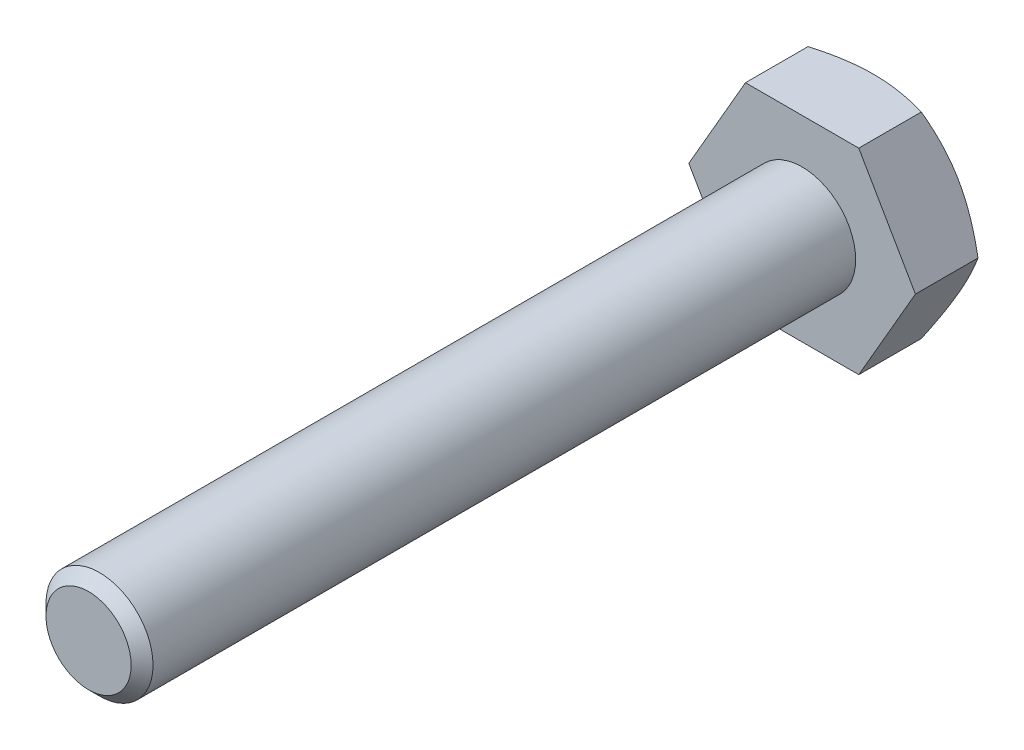
ISO-10303-21;
HEADER;
FILE_DESCRIPTION(('STEP AP214'),'2;1');
FILE_NAME('part.step','',(''),(''),'','','');
FILE_SCHEMA(('AUTOMOTIVE_DESIGN { 1 0 10303 214 1 1 1 1 }'));
ENDSEC;
DATA;
#1=APPLICATION_CONTEXT('core data for automotive mechanical design processes');
#2=APPLICATION_PROTOCOL_DEFINITION('international standard','automotive_design',2000,#1);
#3=PRODUCT_CONTEXT('',#1,'mechanical');
#4=PRODUCT('Part','Part','',(#3));
#5=PRODUCT_RELATED_PRODUCT_CATEGORY('part','',(#4));
#6=PRODUCT_DEFINITION_FORMATION('','',#4);
#7=PRODUCT_DEFINITION_CONTEXT('part definition',#1,'design');
#8=PRODUCT_DEFINITION('design','',#6,#7);
#9=PRODUCT_DEFINITION_SHAPE('','',#8);
#10=(LENGTH_UNIT() NAMED_UNIT(*) SI_UNIT(.MILLI.,.METRE.));
#11=(NAMED_UNIT(*) PLANE_ANGLE_UNIT() SI_UNIT($,.RADIAN.));
#12=(NAMED_UNIT(*) SI_UNIT($,.STERADIAN.) SOLID_ANGLE_UNIT());
#13=UNCERTAINTY_MEASURE_WITH_UNIT(LENGTH_MEASURE(1.E-05),#10,'distance_accuracy_value','');
#14=(GEOMETRIC_REPRESENTATION_CONTEXT(3) GLOBAL_UNCERTAINTY_ASSIGNED_CONTEXT((#13)) GLOBAL_UNIT_ASSIGNED_CONTEXT((#10,
#11,#12)) REPRESENTATION_CONTEXT('',''));
#15=CARTESIAN_POINT('',(0.,0.,0.));
#16=DIRECTION('',(0.,0.,1.));
#17=DIRECTION('',(1.,0.,0.));
#18=AXIS2_PLACEMENT_3D('',#15,#16,#17);
#19=CARTESIAN_POINT('',(1.58771324027147,-2.75,2.));
#20=DIRECTION('',(-0.866025403784439,0.5,0.));
#21=DIRECTION('',(-0.5,-0.866025403784439,0.));
#22=AXIS2_PLACEMENT_3D('',#19,#20,#21);
#23=PLANE('',#22);
#24=CARTESIAN_POINT('',(3.17554195059678,0.000200000000001707,0.245686763364756));
#25=CARTESIAN_POINT('',(3.10576962051743,-0.120649220659903,0.205387662249254));
#26=CARTESIAN_POINT('',(3.03539502097908,-0.24254160262263,0.168736902597655));
#27=CARTESIAN_POINT('',(2.89342717394439,-0.488437126727888,0.104762182969802));
#28=CARTESIAN_POINT('',(2.82183140359859,-0.612444638573851,0.0774608556745041));
#29=CARTESIAN_POINT('',(2.67952717191843,-0.858922797975938,0.0349617452941237));
#30=CARTESIAN_POINT('',(2.60884060771578,-0.981355518587411,0.0194811186224597));
#31=CARTESIAN_POINT('',(2.46713482015519,-1.22679714236891,0.000999397369939557));
#32=CARTESIAN_POINT('',(2.39611611197038,-1.3498051532329,-0.00201700053739912));
#33=CARTESIAN_POINT('',(2.26341005486545,-1.57965878661078,0.00425314542854933));
#34=CARTESIAN_POINT('',(2.20170285541369,-1.68653879125401,0.0120001542767048));
#35=CARTESIAN_POINT('',(2.07869048467395,-1.89960246733474,0.0365551810643593));
#36=CARTESIAN_POINT('',(2.01738573896434,-2.00578540164888,0.053371589650577));
#37=CARTESIAN_POINT('',(1.89411967378235,-2.21928848939318,0.0954119223459613));
#38=CARTESIAN_POINT('',(1.83217395817123,-2.32658161614285,0.120814080687232));
#39=CARTESIAN_POINT('',(1.70920651275308,-2.53956747928405,0.178467225839978));
#40=CARTESIAN_POINT('',(1.64818320715446,-2.64526294502665,0.210704663298978));
#41=CARTESIAN_POINT('',(1.58759777021763,-2.7502,0.245686763364763));
#42=B_SPLINE_CURVE_WITH_KNOTS('',3,(#24,#25,#26,#27,#28,#29,#30,#31,#32,#33,#34,#35,#36,#37,#38,
#39,#40,#41),.UNSPECIFIED.,.F.,.F.,(4,2,2,2,2,2,2,2,4),(0.,0.435912828725885,0.872873557116326,
1.29901931904671,1.72464171213572,2.09526089052937,2.46622354066374,2.84541551798557,
3.22386274754524),.UNSPECIFIED.);
#43=CARTESIAN_POINT('',(3.17542648054293,0.,0.245620093061856));
#44=VERTEX_POINT('',#43);
#45=CARTESIAN_POINT('',(2.38156986040721,-1.375,0.));
#46=VERTEX_POINT('',#45);
#47=EDGE_CURVE('E128',#44,#46,#42,.T.);
#48=ORIENTED_EDGE('',*,*,#47,.F.);
#49=DIRECTION('',(0.,0.,-1.));
#50=VECTOR('',#49,1.);
#51=CARTESIAN_POINT('',(3.17542648054294,0.,2.));
#52=LINE('',#51,#50);
#53=CARTESIAN_POINT('',(3.17542648054294,0.,2.));
#54=VERTEX_POINT('',#53);
#55=EDGE_CURVE('E132',#54,#44,#52,.T.);
#56=ORIENTED_EDGE('',*,*,#55,.F.);
#57=DIRECTION('',(0.5,0.866025403784438,0.));
#58=VECTOR('',#57,1.);
#59=CARTESIAN_POINT('',(1.58771324027147,-2.75,2.));
#60=LINE('',#59,#58);
#61=CARTESIAN_POINT('',(1.58771324027147,-2.75,2.));
#62=VERTEX_POINT('',#61);
#63=EDGE_CURVE('E246',#62,#54,#60,.T.);
#64=ORIENTED_EDGE('',*,*,#63,.F.);
#65=DIRECTION('',(0.,0.,-1.));
#66=VECTOR('',#65,1.);
#67=CARTESIAN_POINT('',(1.58771324027147,-2.75,2.));
#68=LINE('',#67,#66);
#69=CARTESIAN_POINT('',(1.58771324027145,-2.75,0.245620093061854));
#70=VERTEX_POINT('',#69);
#71=EDGE_CURVE('E222',#62,#70,#68,.T.);
#72=ORIENTED_EDGE('',*,*,#71,.T.);
#73=EDGE_CURVE('E185',#46,#70,#42,.T.);
#74=ORIENTED_EDGE('',*,*,#73,.F.);
#75=EDGE_LOOP('',(#48,#56,#64,#72,#74));
#76=FACE_BOUND('',#75,.T.);
#77=ADVANCED_FACE('F36',(#76),#23,.F.);
#78=CARTESIAN_POINT('',(3.17542648054294,0.,2.));
#79=DIRECTION('',(-0.866025403784438,-0.5,0.));
#80=DIRECTION('',(0.5,-0.866025403784438,0.));
#81=AXIS2_PLACEMENT_3D('',#78,#79,#80);
#82=PLANE('',#81);
#83=CARTESIAN_POINT('',(1.58759777021763,2.7502,0.245686763364752));
#84=CARTESIAN_POINT('',(1.65737010029698,2.6293507793401,0.205387662249252));
#85=CARTESIAN_POINT('',(1.72774469983533,2.50745839737737,0.168736902597655));
#86=CARTESIAN_POINT('',(1.86971254687002,2.26156287327211,0.104762182969804));
#87=CARTESIAN_POINT('',(1.94130831721583,2.13755536142615,0.0774608556745066));
#88=CARTESIAN_POINT('',(2.08361254889599,1.89107720202406,0.0349617452941277));
#89=CARTESIAN_POINT('',(2.15429911309864,1.76864448141259,0.0194811186224644));
#90=CARTESIAN_POINT('',(2.29600490065922,1.52320285763109,0.000999397369945049));
#91=CARTESIAN_POINT('',(2.36702360884403,1.40019484676709,-0.00201700053739336));
#92=CARTESIAN_POINT('',(2.49972966594897,1.17034121338921,0.00425314542855519));
#93=CARTESIAN_POINT('',(2.56143686540072,1.06346120874598,0.0120001542767105));
#94=CARTESIAN_POINT('',(2.68444923614046,0.850397532665255,0.0365551810643646));
#95=CARTESIAN_POINT('',(2.74575398185008,0.744214598351115,0.0533715896505821));
#96=CARTESIAN_POINT('',(2.86902004703206,0.530711510606819,0.0954119223459655));
#97=CARTESIAN_POINT('',(2.93096576264318,0.423418383857147,0.120814080687235));
#98=CARTESIAN_POINT('',(3.05393320806134,0.210432520715949,0.17846722583998));
#99=CARTESIAN_POINT('',(3.11495651365995,0.104737054973347,0.210704663298979));
#100=CARTESIAN_POINT('',(3.17554195059678,-0.000199999999999859,0.245686763364762));
#101=B_SPLINE_CURVE_WITH_KNOTS('',3,(#83,#84,#85,#86,#87,#88,#89,#90,#91,#92,#93,#94,#95,#96,
#97,#98,#99,#100),.UNSPECIFIED.,.F.,.F.,(4,2,2,2,2,2,2,2,4),(0.,0.435912828725885,
0.872873557116326,1.29901931904671,1.72464171213573,2.09526089052937,2.46622354066374,
2.84541551798557,3.22386274754524),.UNSPECIFIED.);
#102=CARTESIAN_POINT('',(1.58771324027148,2.74999999999998,0.245620093061853));
#103=VERTEX_POINT('',#102);
#104=CARTESIAN_POINT('',(2.38156986040721,1.375,0.));
#105=VERTEX_POINT('',#104);
#106=EDGE_CURVE('E107',#103,#105,#101,.T.);
#107=ORIENTED_EDGE('',*,*,#106,.F.);
#108=DIRECTION('',(0.,0.,-1.));
#109=VECTOR('',#108,1.);
#110=CARTESIAN_POINT('',(1.58771324027147,2.75,2.));
#111=LINE('',#110,#109);
#112=CARTESIAN_POINT('',(1.58771324027147,2.75,2.));
#113=VERTEX_POINT('',#112);
#114=EDGE_CURVE('E231',#113,#103,#111,.T.);
#115=ORIENTED_EDGE('',*,*,#114,.F.);
#116=DIRECTION('',(-0.5,0.866025403784438,0.));
#117=VECTOR('',#116,1.);
#118=CARTESIAN_POINT('',(3.17542648054294,0.,2.));
#119=LINE('',#118,#117);
#120=EDGE_CURVE('E250',#54,#113,#119,.T.);
#121=ORIENTED_EDGE('',*,*,#120,.F.);
#122=ORIENTED_EDGE('',*,*,#55,.T.);
#123=EDGE_CURVE('E120',#105,#44,#101,.T.);
#124=ORIENTED_EDGE('',*,*,#123,.F.);
#125=EDGE_LOOP('',(#107,#115,#121,#122,#124));
#126=FACE_BOUND('',#125,.T.);
#127=ADVANCED_FACE('F140',(#126),#82,.F.);
#128=CARTESIAN_POINT('',(1.58771324027147,2.75,2.));
#129=DIRECTION('',(0.,-1.,0.));
#130=DIRECTION('',(0.,0.,-1.));
#131=AXIS2_PLACEMENT_3D('',#128,#129,#130);
#132=PLANE('',#131);
#133=CARTESIAN_POINT('',(-4.31638594918232,2.75,1.36715210704405));
#134=CARTESIAN_POINT('',(-4.19581737051592,2.75,1.30845994096474));
#135=CARTESIAN_POINT('',(-4.07497746694739,2.75,1.25031586425216));
#136=CARTESIAN_POINT('',(-3.83261088383623,2.75,1.13543119741228));
#137=CARTESIAN_POINT('',(-3.71108410410335,2.75,1.07869081888196));
#138=CARTESIAN_POINT('',(-3.46659808789897,2.75,0.966646426591317));
#139=CARTESIAN_POINT('',(-3.34363468385964,2.75,0.911351476138761));
#140=CARTESIAN_POINT('',(-3.09674757673776,2.75,0.802956993957643));
#141=CARTESIAN_POINT('',(-2.972823917902,2.75,0.749857361778766));
#142=CARTESIAN_POINT('',(-2.71965806564943,2.75,0.644703117588246));
#143=CARTESIAN_POINT('',(-2.59037652858395,2.75,0.592742724367116));
#144=CARTESIAN_POINT('',(-2.33032018429188,2.75,0.492631038352346));
#145=CARTESIAN_POINT('',(-2.19954521421087,2.75,0.444480165603219));
#146=CARTESIAN_POINT('',(-1.9365223444922,2.75,0.353213656190183));
#147=CARTESIAN_POINT('',(-1.80427786301001,2.75,0.310088265151207));
#148=CARTESIAN_POINT('',(-1.53789259482414,2.75,0.230222209632179));
#149=CARTESIAN_POINT('',(-1.40375240288282,2.75,0.193479588678769));
#150=CARTESIAN_POINT('',(-1.13423793476322,2.75,0.128302067791659));
#151=CARTESIAN_POINT('',(-0.998874970875652,2.75,0.0998212369444805));
#152=CARTESIAN_POINT('',(-0.726413092453885,2.75,0.0527456161691723));
#153=CARTESIAN_POINT('',(-0.589314364619276,2.75,0.0341497721022308));
#154=CARTESIAN_POINT('',(-0.315877662564309,2.75,0.00856858652498791));
#155=CARTESIAN_POINT('',(-0.179554395289457,2.75,0.0014299267905237));
#156=CARTESIAN_POINT('',(0.0932131339370565,2.75,-0.00103867463557896));
#157=CARTESIAN_POINT('',(0.229657397936016,2.75,0.00363158744684535));
#158=CARTESIAN_POINT('',(0.459764674388275,2.75,0.0211304631968855));
#159=CARTESIAN_POINT('',(0.553667213671686,2.75,0.0310050171194729));
#160=CARTESIAN_POINT('',(0.740814471055632,2.75,0.055760139531657));
#161=CARTESIAN_POINT('',(0.834059104056982,2.75,0.0706413439292701));
#162=CARTESIAN_POINT('',(1.11266283109748,2.75,0.122015798898182));
#163=CARTESIAN_POINT('',(1.29679769159134,2.75,0.165231761163537));
#164=CARTESIAN_POINT('',(1.57226006867404,2.75,0.240559912331172));
#165=CARTESIAN_POINT('',(1.66500394654352,2.75,0.267790894506829));
#166=CARTESIAN_POINT('',(1.84959145582332,2.75,0.325176661417261));
#167=CARTESIAN_POINT('',(1.9414350804195,2.75,0.355331468264057));
#168=CARTESIAN_POINT('',(2.12425036464145,2.75,0.418073021824297));
#169=CARTESIAN_POINT('',(2.21522226940173,2.75,0.450659060772911));
#170=CARTESIAN_POINT('',(2.3964050130485,2.75,0.517870145035879));
#171=CARTESIAN_POINT('',(2.48661586829762,2.75,0.552495146383974));
#172=CARTESIAN_POINT('',(2.72631941369534,2.75,0.647111868128739));
#173=CARTESIAN_POINT('',(2.87521406734214,2.75,0.708617133437105));
#174=CARTESIAN_POINT('',(3.17149877963133,2.75,0.835163108096415));
#175=CARTESIAN_POINT('',(3.31888867900127,2.75,0.900204187184521));
#176=CARTESIAN_POINT('',(3.612498606976,2.75,1.0329937298421));
#177=CARTESIAN_POINT('',(3.7587182324204,2.75,1.10074308197789));
#178=CARTESIAN_POINT('',(4.05017738563283,2.75,1.23832197569377));
#179=CARTESIAN_POINT('',(4.1954168842448,2.75,1.3081515788239));
#180=CARTESIAN_POINT('',(4.63039070223179,2.75,1.52027220806308));
#181=CARTESIAN_POINT('',(4.91893915080495,2.75,1.66499194206909));
#182=CARTESIAN_POINT('',(5.49386340867002,2.75,1.95851426505822));
#183=CARTESIAN_POINT('',(5.78023963786972,2.75,2.1073160378755));
#184=CARTESIAN_POINT('',(6.32194576487132,2.75,2.39216757225533));
#185=CARTESIAN_POINT('',(6.57742037004848,2.75,2.52794261914921));
#186=CARTESIAN_POINT('',(7.08750371442345,2.75,2.80114245272759));
#187=CARTESIAN_POINT('',(7.34211240206399,2.75,2.93856733551162));
#188=CARTESIAN_POINT('',(7.84983547824256,2.75,3.21419429818602));
#189=CARTESIAN_POINT('',(8.10295203313654,2.75,3.35239239225699));
#190=CARTESIAN_POINT('',(8.60864374493556,2.75,3.62973059253265));
#191=CARTESIAN_POINT('',(8.86121894150219,2.75,3.76887062638957));
#192=CARTESIAN_POINT('',(9.11360311770114,2.75,3.90835389259637));
#193=B_SPLINE_CURVE_WITH_KNOTS('',3,(#133,#134,#135,#136,#137,#138,#139,#140,#141,#142,#143,
#144,#145,#146,#147,#148,#149,#150,#151,#152,#153,#154,#155,#156,#157,#158,#159,#160,#161,#162,
#163,#164,#165,#166,#167,#168,#169,#170,#171,#172,#173,#174,#175,#176,#177,#178,#179,#180,#181,
#182,#183,#184,#185,#186,#187,#188,#189,#190,#191,#192),.UNSPECIFIED.,.F.,.F.,(4,2,2,2,2,2,2,2,
2,2,2,2,2,2,2,2,2,2,2,2,2,2,2,2,2,2,2,2,2,4),(0.,0.402290608258888,0.80464149378454,
1.20909649725655,1.61353297371178,2.03148461048144,2.44948226730263,2.86665458560833,
3.28369880400756,3.69837799217314,4.1130129499138,4.52205162226931,4.93109735302036,
5.21422195546482,5.49738253190362,6.06398562819829,6.35393648052208,6.64388952582945,
6.93375848874895,7.22362120349515,7.70684704660544,8.19012351781079,8.67355987154431,
9.15701054332948,10.1253686031769,11.0935344400116,11.9614658313278,12.8294480255312,
13.6946049258819,14.5596961132789),.UNSPECIFIED.);
#194=CARTESIAN_POINT('',(-1.58771324027148,2.74999999999998,0.245620093061856));
#195=VERTEX_POINT('',#194);
#196=CARTESIAN_POINT('',(0.,2.75,0.));
#197=VERTEX_POINT('',#196);
#198=EDGE_CURVE('E51',#195,#197,#193,.T.);
#199=ORIENTED_EDGE('',*,*,#198,.F.);
#200=DIRECTION('',(0.,0.,-1.));
#201=VECTOR('',#200,1.);
#202=CARTESIAN_POINT('',(-1.58771324027147,2.75,2.));
#203=LINE('',#202,#201);
#204=CARTESIAN_POINT('',(-1.58771324027147,2.75,2.));
#205=VERTEX_POINT('',#204);
#206=EDGE_CURVE('E224',#205,#195,#203,.T.);
#207=ORIENTED_EDGE('',*,*,#206,.F.);
#208=DIRECTION('',(-1.,0.,0.));
#209=VECTOR('',#208,1.);
#210=CARTESIAN_POINT('',(1.58771324027147,2.75,2.));
#211=LINE('',#210,#209);
#212=EDGE_CURVE('E254',#113,#205,#211,.T.);
#213=ORIENTED_EDGE('',*,*,#212,.F.);
#214=ORIENTED_EDGE('',*,*,#114,.T.);
#215=EDGE_CURVE('E114',#197,#103,#193,.T.);
#216=ORIENTED_EDGE('',*,*,#215,.F.);
#217=EDGE_LOOP('',(#199,#207,#213,#214,#216));
#218=FACE_BOUND('',#217,.T.);
#219=ADVANCED_FACE('F195',(#218),#132,.F.);
#220=CARTESIAN_POINT('',(-1.58771324027147,2.75,2.));
#221=DIRECTION('',(0.866025403784439,-0.5,0.));
#222=DIRECTION('',(0.5,0.866025403784439,0.));
#223=AXIS2_PLACEMENT_3D('',#220,#221,#222);
#224=PLANE('',#223);
#225=CARTESIAN_POINT('',(-3.17554195059678,-0.000200000000001425,0.245686763364756));
#226=CARTESIAN_POINT('',(-3.10576962051743,0.120649220659901,0.205387662249244));
#227=CARTESIAN_POINT('',(-3.03539502097908,0.242541602622629,0.168736902597647));
#228=CARTESIAN_POINT('',(-2.89342717394439,0.488437126727888,0.104762182969802));
#229=CARTESIAN_POINT('',(-2.82183140359859,0.612444638573852,0.0774608556745108));
#230=CARTESIAN_POINT('',(-2.67952717191843,0.85892279797594,0.0349617452941296));
#231=CARTESIAN_POINT('',(-2.60884060771578,0.981355518587412,0.0194811186224586));
#232=CARTESIAN_POINT('',(-2.46713482015519,1.22679714236891,0.000999397369939867));
#233=CARTESIAN_POINT('',(-2.39611611197038,1.3498051532329,-0.00201700053739041));
#234=CARTESIAN_POINT('',(-2.26341005486545,1.57965878661079,0.00425314542855696));
#235=CARTESIAN_POINT('',(-2.20170285541369,1.68653879125402,0.0120001542767051));
#236=CARTESIAN_POINT('',(-2.07869048467395,1.89960246733474,0.0365551810643579));
#237=CARTESIAN_POINT('',(-2.01738573896434,2.00578540164888,0.0533715896505813));
#238=CARTESIAN_POINT('',(-1.89411967378235,2.21928848939318,0.0954119223459695));
#239=CARTESIAN_POINT('',(-1.83217395817123,2.32658161614285,0.120814080687238));
#240=CARTESIAN_POINT('',(-1.70920651275308,2.53956747928405,0.17846722583998));
#241=CARTESIAN_POINT('',(-1.64818320715446,2.64526294502665,0.210704663298978));
#242=CARTESIAN_POINT('',(-1.58759777021763,2.7502,0.245686763364763));
#243=B_SPLINE_CURVE_WITH_KNOTS('',3,(#225,#226,#227,#228,#229,#230,#231,#232,#233,#234,#235,
#236,#237,#238,#239,#240,#241,#242),.UNSPECIFIED.,.F.,.F.,(4,2,2,2,2,2,2,2,4),(0.,
0.435912828725885,0.872873557116327,1.29901931904671,1.72464171213573,2.09526089052937,
2.46622354066374,2.84541551798557,3.22386274754524),.UNSPECIFIED.);
#244=CARTESIAN_POINT('',(-3.17542648054293,0.,0.245620093061855));
#245=VERTEX_POINT('',#244);
#246=CARTESIAN_POINT('',(-2.38156986040721,1.375,0.));
#247=VERTEX_POINT('',#246);
#248=EDGE_CURVE('E59',#245,#247,#243,.T.);
#249=ORIENTED_EDGE('',*,*,#248,.F.);
#250=DIRECTION('',(0.,0.,-1.));
#251=VECTOR('',#250,1.);
#252=CARTESIAN_POINT('',(-3.17542648054294,0.,2.));
#253=LINE('',#252,#251);
#254=CARTESIAN_POINT('',(-3.17542648054294,0.,2.));
#255=VERTEX_POINT('',#254);
#256=EDGE_CURVE('E221',#255,#245,#253,.T.);
#257=ORIENTED_EDGE('',*,*,#256,.F.);
#258=DIRECTION('',(-0.5,-0.866025403784438,0.));
#259=VECTOR('',#258,1.);
#260=CARTESIAN_POINT('',(-1.58771324027147,2.75,2.));
#261=LINE('',#260,#259);
#262=EDGE_CURVE('E256',#205,#255,#261,.T.);
#263=ORIENTED_EDGE('',*,*,#262,.F.);
#264=ORIENTED_EDGE('',*,*,#206,.T.);
#265=EDGE_CURVE('E119',#247,#195,#243,.T.);
#266=ORIENTED_EDGE('',*,*,#265,.F.);
#267=EDGE_LOOP('',(#249,#257,#263,#264,#266));
#268=FACE_BOUND('',#267,.T.);
#269=ADVANCED_FACE('F240',(#268),#224,.F.);
#270=CARTESIAN_POINT('',(-3.17542648054294,0.,2.));
#271=DIRECTION('',(0.866025403784438,0.5,0.));
#272=DIRECTION('',(-0.5,0.866025403784438,0.));
#273=AXIS2_PLACEMENT_3D('',#270,#271,#272);
#274=PLANE('',#273);
#275=CARTESIAN_POINT('',(-1.58759777021763,-2.7502,0.245686763364752));
#276=CARTESIAN_POINT('',(-1.65737010029698,-2.6293507793401,0.205387662249251));
#277=CARTESIAN_POINT('',(-1.72774469983533,-2.50745839737737,0.168736902597654));
#278=CARTESIAN_POINT('',(-1.86971254687003,-2.26156287327211,0.104762182969803));
#279=CARTESIAN_POINT('',(-1.94130831721583,-2.13755536142615,0.0774608556745064));
#280=CARTESIAN_POINT('',(-2.08361254889599,-1.89107720202406,0.0349617452941278));
#281=CARTESIAN_POINT('',(-2.15429911309864,-1.76864448141259,0.0194811186224644));
#282=CARTESIAN_POINT('',(-2.29600490065922,-1.52320285763109,0.000999397369945159));
#283=CARTESIAN_POINT('',(-2.36702360884403,-1.40019484676709,-0.00201700053739319));
#284=CARTESIAN_POINT('',(-2.49972966594897,-1.17034121338921,0.00425314542855519));
#285=CARTESIAN_POINT('',(-2.56143686540072,-1.06346120874598,0.0120001542767104));
#286=CARTESIAN_POINT('',(-2.68444923614046,-0.850397532665254,0.0365551810643644));
#287=CARTESIAN_POINT('',(-2.74575398185008,-0.744214598351115,0.053371589650582));
#288=CARTESIAN_POINT('',(-2.86902004703206,-0.530711510606819,0.0954119223459656));
#289=CARTESIAN_POINT('',(-2.93096576264318,-0.423418383857146,0.120814080687235));
#290=CARTESIAN_POINT('',(-3.05393320806134,-0.210432520715948,0.17846722583998));
#291=CARTESIAN_POINT('',(-3.11495651365995,-0.104737054973347,0.210704663298979));
#292=CARTESIAN_POINT('',(-3.17554195059678,0.000200000000000259,0.245686763364762));
#293=B_SPLINE_CURVE_WITH_KNOTS('',3,(#275,#276,#277,#278,#279,#280,#281,#282,#283,#284,#285,
#286,#287,#288,#289,#290,#291,#292),.UNSPECIFIED.,.F.,.F.,(4,2,2,2,2,2,2,2,4),(0.,
0.435912828725885,0.872873557116326,1.29901931904671,1.72464171213573,2.09526089052937,
2.46622354066374,2.84541551798557,3.22386274754524),.UNSPECIFIED.);
#294=CARTESIAN_POINT('',(-1.58771324027162,-2.75,0.245620093061744));
#295=VERTEX_POINT('',#294);
#296=CARTESIAN_POINT('',(-2.38156986040721,-1.375,0.));
#297=VERTEX_POINT('',#296);
#298=EDGE_CURVE('E179',#295,#297,#293,.T.);
#299=ORIENTED_EDGE('',*,*,#298,.F.);
#300=DIRECTION('',(0.,0.,-1.));
#301=VECTOR('',#300,1.);
#302=CARTESIAN_POINT('',(-1.58771324027147,-2.75,2.));
#303=LINE('',#302,#301);
#304=CARTESIAN_POINT('',(-1.58771324027147,-2.75,2.));
#305=VERTEX_POINT('',#304);
#306=EDGE_CURVE('E215',#305,#295,#303,.T.);
#307=ORIENTED_EDGE('',*,*,#306,.F.);
#308=DIRECTION('',(0.5,-0.866025403784438,0.));
#309=VECTOR('',#308,1.);
#310=CARTESIAN_POINT('',(-3.17542648054294,0.,2.));
#311=LINE('',#310,#309);
#312=EDGE_CURVE('E258',#255,#305,#311,.T.);
#313=ORIENTED_EDGE('',*,*,#312,.F.);
#314=ORIENTED_EDGE('',*,*,#256,.T.);
#315=EDGE_CURVE('E142',#297,#245,#293,.T.);
#316=ORIENTED_EDGE('',*,*,#315,.F.);
#317=EDGE_LOOP('',(#299,#307,#313,#314,#316));
#318=FACE_BOUND('',#317,.T.);
#319=ADVANCED_FACE('F213',(#318),#274,.F.);
#320=CARTESIAN_POINT('',(-1.58771324027147,-2.75,2.));
#321=DIRECTION('',(0.,1.,0.));
#322=DIRECTION('',(-1.,0.,0.));
#323=AXIS2_PLACEMENT_3D('',#320,#321,#322);
#324=PLANE('',#323);
#325=CARTESIAN_POINT('',(-4.31638594918231,-2.75,1.36715210704405));
#326=CARTESIAN_POINT('',(-4.19581737051592,-2.75,1.30845994096474));
#327=CARTESIAN_POINT('',(-4.07497746694739,-2.75,1.25031586425216));
#328=CARTESIAN_POINT('',(-3.83261088383623,-2.75,1.13543119741228));
#329=CARTESIAN_POINT('',(-3.71108410410335,-2.75,1.07869081888196));
#330=CARTESIAN_POINT('',(-3.46659808789897,-2.75,0.966646426591317));
#331=CARTESIAN_POINT('',(-3.34363468385964,-2.75,0.911351476138761));
#332=CARTESIAN_POINT('',(-3.09674757673776,-2.75,0.802956993957643));
#333=CARTESIAN_POINT('',(-2.972823917902,-2.75,0.749857361778766));
#334=CARTESIAN_POINT('',(-2.71965806564943,-2.75,0.644703117588245));
#335=CARTESIAN_POINT('',(-2.59037652858395,-2.75,0.592742724367116));
#336=CARTESIAN_POINT('',(-2.33032018429188,-2.75,0.492631038352346));
#337=CARTESIAN_POINT('',(-2.19954521421087,-2.75,0.444480165603219));
#338=CARTESIAN_POINT('',(-1.9365223444922,-2.75,0.353213656190183));
#339=CARTESIAN_POINT('',(-1.80427786301001,-2.75,0.310088265151207));
#340=CARTESIAN_POINT('',(-1.53789259482414,-2.75,0.230222209632179));
#341=CARTESIAN_POINT('',(-1.40375240288282,-2.75,0.193479588678769));
#342=CARTESIAN_POINT('',(-1.13423793476322,-2.75,0.128302067791659));
#343=CARTESIAN_POINT('',(-0.998874970875651,-2.75,0.0998212369444806));
#344=CARTESIAN_POINT('',(-0.726413092453884,-2.75,0.0527456161691724));
#345=CARTESIAN_POINT('',(-0.589314364619276,-2.75,0.0341497721022307));
#346=CARTESIAN_POINT('',(-0.315877662564308,-2.75,0.00856858652498762));
#347=CARTESIAN_POINT('',(-0.179554395289456,-2.75,0.00142992679052341));
#348=CARTESIAN_POINT('',(0.0932131339370574,-2.75,-0.00103867463557906));
#349=CARTESIAN_POINT('',(0.229657397936017,-2.75,0.00363158744684545));
#350=CARTESIAN_POINT('',(0.459764674388276,-2.75,0.0211304631968855));
#351=CARTESIAN_POINT('',(0.553667213671687,-2.75,0.0310050171194728));
#352=CARTESIAN_POINT('',(0.740814471055633,-2.75,0.0557601395316572));
#353=CARTESIAN_POINT('',(0.834059104056983,-2.75,0.0706413439292707));
#354=CARTESIAN_POINT('',(1.11266283109748,-2.75,0.122015798898182));
#355=CARTESIAN_POINT('',(1.29679769159134,-2.75,0.165231761163532));
#356=CARTESIAN_POINT('',(1.57226006867404,-2.75,0.240559912331175));
#357=CARTESIAN_POINT('',(1.66500394654352,-2.75,0.267790894506837));
#358=CARTESIAN_POINT('',(1.84959145582332,-2.75,0.325176661417269));
#359=CARTESIAN_POINT('',(1.9414350804195,-2.75,0.35533146826406));
#360=CARTESIAN_POINT('',(2.12425036464146,-2.75,0.418073021824296));
#361=CARTESIAN_POINT('',(2.21522226940173,-2.75,0.450659060772911));
#362=CARTESIAN_POINT('',(2.3964050130485,-2.75,0.51787014503588));
#363=CARTESIAN_POINT('',(2.48661586829762,-2.75,0.552495146383975));
#364=CARTESIAN_POINT('',(2.72631941369534,-2.75,0.64711186812874));
#365=CARTESIAN_POINT('',(2.87521406734214,-2.75,0.708617133437106));
#366=CARTESIAN_POINT('',(3.17149877963133,-2.75,0.835163108096417));
#367=CARTESIAN_POINT('',(3.31888867900127,-2.75,0.900204187184522));
#368=CARTESIAN_POINT('',(3.612498606976,-2.75,1.0329937298421));
#369=CARTESIAN_POINT('',(3.7587182324204,-2.75,1.10074308197789));
#370=CARTESIAN_POINT('',(4.05017738563283,-2.75,1.23832197569377));
#371=CARTESIAN_POINT('',(4.19541688424481,-2.75,1.3081515788239));
#372=CARTESIAN_POINT('',(4.63039070223179,-2.75,1.52027220806308));
#373=CARTESIAN_POINT('',(4.91893915080495,-2.75,1.6649919420691));
#374=CARTESIAN_POINT('',(5.49386340867001,-2.75,1.95851426505822));
#375=CARTESIAN_POINT('',(5.78023963786972,-2.75,2.1073160378755));
#376=CARTESIAN_POINT('',(6.32194576487132,-2.75,2.39216757225532));
#377=CARTESIAN_POINT('',(6.57742037004848,-2.75,2.5279426191492));
#378=CARTESIAN_POINT('',(7.08750371442345,-2.75,2.80114245272759));
#379=CARTESIAN_POINT('',(7.34211240206399,-2.75,2.93856733551163));
#380=CARTESIAN_POINT('',(7.84983547824256,-2.75,3.21419429818602));
#381=CARTESIAN_POINT('',(8.10295203313654,-2.75,3.35239239225698));
#382=CARTESIAN_POINT('',(8.60864374493556,-2.75,3.62973059253264));
#383=CARTESIAN_POINT('',(8.8612189415022,-2.75,3.76887062638956));
#384=CARTESIAN_POINT('',(9.11360311770115,-2.75,3.90835389259637));
#385=B_SPLINE_CURVE_WITH_KNOTS('',3,(#325,#326,#327,#328,#329,#330,#331,#332,#333,#334,#335,
#336,#337,#338,#339,#340,#341,#342,#343,#344,#345,#346,#347,#348,#349,#350,#351,#352,#353,#354,
#355,#356,#357,#358,#359,#360,#361,#362,#363,#364,#365,#366,#367,#368,#369,#370,#371,#372,#373,
#374,#375,#376,#377,#378,#379,#380,#381,#382,#383,#384),.UNSPECIFIED.,.F.,.F.,(4,2,2,2,2,2,2,2,
2,2,2,2,2,2,2,2,2,2,2,2,2,2,2,2,2,2,2,2,2,4),(0.,0.402290608258888,0.80464149378454,
1.20909649725655,1.61353297371178,2.03148461048144,2.44948226730263,2.86665458560833,
3.28369880400756,3.69837799217314,4.1130129499138,4.52205162226931,4.93109735302036,
5.21422195546482,5.49738253190362,6.06398562819829,6.35393648052208,6.64388952582945,
6.93375848874895,7.22362120349515,7.70684704660544,8.19012351781079,8.67355987154431,
9.15701054332948,10.1253686031769,11.0935344400116,11.9614658313277,12.8294480255312,
13.6946049258819,14.5596961132789),.UNSPECIFIED.);
#386=CARTESIAN_POINT('',(0.,-2.75,0.));
#387=VERTEX_POINT('',#386);
#388=EDGE_CURVE('E199',#70,#387,#385,.F.);
#389=ORIENTED_EDGE('',*,*,#388,.F.);
#390=ORIENTED_EDGE('',*,*,#71,.F.);
#391=DIRECTION('',(1.,0.,0.));
#392=VECTOR('',#391,1.);
#393=CARTESIAN_POINT('',(-1.58771324027147,-2.75,2.));
#394=LINE('',#393,#392);
#395=EDGE_CURVE('E220',#305,#62,#394,.T.);
#396=ORIENTED_EDGE('',*,*,#395,.F.);
#397=ORIENTED_EDGE('',*,*,#306,.T.);
#398=EDGE_CURVE('E137',#387,#295,#385,.F.);
#399=ORIENTED_EDGE('',*,*,#398,.F.);
#400=EDGE_LOOP('',(#389,#390,#396,#397,#399));
#401=FACE_BOUND('',#400,.T.);
#402=ADVANCED_FACE('F218',(#401),#324,.F.);
#403=CARTESIAN_POINT('',(3.17542648054294,0.,2.));
#404=DIRECTION('',(0.,0.,1.));
#405=DIRECTION('',(1.,0.,0.));
#406=AXIS2_PLACEMENT_3D('',#403,#404,#405);
#407=PLANE('',#406);
#408=ORIENTED_EDGE('',*,*,#63,.T.);
#409=ORIENTED_EDGE('',*,*,#120,.T.);
#410=ORIENTED_EDGE('',*,*,#212,.T.);
#411=ORIENTED_EDGE('',*,*,#262,.T.);
#412=ORIENTED_EDGE('',*,*,#312,.T.);
#413=ORIENTED_EDGE('',*,*,#395,.T.);
#414=EDGE_LOOP('',(#408,#409,#410,#411,#412,#413));
#415=FACE_BOUND('',#414,.T.);
#416=CARTESIAN_POINT('',(0.,0.,2.));
#417=DIRECTION('',(0.,0.,1.));
#418=DIRECTION('',(1.,0.,0.));
#419=AXIS2_PLACEMENT_3D('',#416,#417,#418);
#420=CIRCLE('',#419,1.5);
#421=CARTESIAN_POINT('',(1.5,0.,2.));
#422=VERTEX_POINT('',#421);
#423=EDGE_CURVE('E244',#422,#422,#420,.T.);
#424=ORIENTED_EDGE('',*,*,#423,.F.);
#425=EDGE_LOOP('',(#424));
#426=FACE_BOUND('',#425,.T.);
#427=ADVANCED_FACE('F260',(#415,#426),#407,.T.);
#428=CARTESIAN_POINT('',(0.,0.,22.));
#429=DIRECTION('',(0.,0.,-1.));
#430=DIRECTION('',(-1.,0.,0.));
#431=AXIS2_PLACEMENT_3D('',#428,#429,#430);
#432=CYLINDRICAL_SURFACE('',#431,1.5);
#433=CARTESIAN_POINT('',(0.,0.,21.693));
#434=DIRECTION('',(0.,0.,1.));
#435=DIRECTION('',(1.,0.,0.));
#436=AXIS2_PLACEMENT_3D('',#433,#434,#435);
#437=CIRCLE('',#436,1.5);
#438=CARTESIAN_POINT('',(1.5,0.,21.693));
#439=VERTEX_POINT('',#438);
#440=EDGE_CURVE('E11',#439,#439,#437,.F.);
#441=ORIENTED_EDGE('',*,*,#440,.T.);
#442=EDGE_LOOP('',(#441));
#443=FACE_BOUND('',#442,.T.);
#444=ORIENTED_EDGE('',*,*,#423,.T.);
#445=EDGE_LOOP('',(#444));
#446=FACE_BOUND('',#445,.T.);
#447=ADVANCED_FACE('F278',(#443,#446),#432,.T.);
#448=CARTESIAN_POINT('',(0.,0.,22.));
#449=DIRECTION('',(0.,0.,1.));
#450=DIRECTION('',(1.,0.,0.));
#451=AXIS2_PLACEMENT_3D('',#448,#449,#450);
#452=PLANE('',#451);
#453=CARTESIAN_POINT('',(0.,0.,22.));
#454=DIRECTION('',(0.,0.,1.));
#455=DIRECTION('',(1.,0.,0.));
#456=AXIS2_PLACEMENT_3D('',#453,#454,#455);
#457=CIRCLE('',#456,1.193);
#458=CARTESIAN_POINT('',(1.193,0.,22.));
#459=VERTEX_POINT('',#458);
#460=EDGE_CURVE('E44',#459,#459,#457,.T.);
#461=ORIENTED_EDGE('',*,*,#460,.T.);
#462=EDGE_LOOP('',(#461));
#463=FACE_BOUND('',#462,.T.);
#464=ADVANCED_FACE('F167',(#463),#452,.T.);
#465=CARTESIAN_POINT('',(0.,0.,57.7350269189618));
#466=DIRECTION('',(0.,0.,1.));
#467=DIRECTION('',(1.,0.,0.));
#468=AXIS2_PLACEMENT_3D('',#465,#466,#467);
#469=CONICAL_SURFACE('',#468,102.75,1.0471975511966);
#470=ORIENTED_EDGE('',*,*,#123,.T.);
#471=ORIENTED_EDGE('',*,*,#47,.T.);
#472=CARTESIAN_POINT('',(0.,0.,0.));
#473=DIRECTION('',(0.,0.,1.));
#474=DIRECTION('',(1.,0.,0.));
#475=AXIS2_PLACEMENT_3D('',#472,#473,#474);
#476=CIRCLE('',#475,2.74999999999999);
#477=EDGE_CURVE('E125',#46,#105,#476,.T.);
#478=ORIENTED_EDGE('',*,*,#477,.T.);
#479=EDGE_LOOP('',(#470,#471,#478));
#480=FACE_BOUND('',#479,.T.);
#481=ADVANCED_FACE('F126',(#480),#469,.T.);
#482=ORIENTED_EDGE('',*,*,#73,.T.);
#483=ORIENTED_EDGE('',*,*,#388,.T.);
#484=EDGE_CURVE('E131',#387,#46,#476,.T.);
#485=ORIENTED_EDGE('',*,*,#484,.T.);
#486=EDGE_LOOP('',(#482,#483,#485));
#487=FACE_BOUND('',#486,.T.);
#488=ADVANCED_FACE('F237',(#487),#469,.T.);
#489=ORIENTED_EDGE('',*,*,#298,.T.);
#490=EDGE_CURVE('E208',#297,#387,#476,.T.);
#491=ORIENTED_EDGE('',*,*,#490,.T.);
#492=ORIENTED_EDGE('',*,*,#398,.T.);
#493=EDGE_LOOP('',(#489,#491,#492));
#494=FACE_BOUND('',#493,.T.);
#495=ADVANCED_FACE('F166',(#494),#469,.T.);
#496=ORIENTED_EDGE('',*,*,#248,.T.);
#497=EDGE_CURVE('E236',#247,#297,#476,.T.);
#498=ORIENTED_EDGE('',*,*,#497,.T.);
#499=ORIENTED_EDGE('',*,*,#315,.T.);
#500=EDGE_LOOP('',(#496,#498,#499));
#501=FACE_BOUND('',#500,.T.);
#502=ADVANCED_FACE('F165',(#501),#469,.T.);
#503=ORIENTED_EDGE('',*,*,#198,.T.);
#504=EDGE_CURVE('E134',#197,#247,#476,.T.);
#505=ORIENTED_EDGE('',*,*,#504,.T.);
#506=ORIENTED_EDGE('',*,*,#265,.T.);
#507=EDGE_LOOP('',(#503,#505,#506));
#508=FACE_BOUND('',#507,.T.);
#509=ADVANCED_FACE('F161',(#508),#469,.T.);
#510=ORIENTED_EDGE('',*,*,#215,.T.);
#511=ORIENTED_EDGE('',*,*,#106,.T.);
#512=CARTESIAN_POINT('',(0.,0.,0.));
#513=DIRECTION('',(0.,0.,1.));
#514=DIRECTION('',(1.,0.,0.));
#515=AXIS2_PLACEMENT_3D('',#512,#513,#514);
#516=CIRCLE('',#515,2.75);
#517=EDGE_CURVE('E111',#105,#197,#516,.T.);
#518=ORIENTED_EDGE('',*,*,#517,.T.);
#519=EDGE_LOOP('',(#510,#511,#518));
#520=FACE_BOUND('',#519,.T.);
#521=ADVANCED_FACE('F109',(#520),#469,.T.);
#522=CARTESIAN_POINT('',(3.17542648054294,0.,0.));
#523=DIRECTION('',(0.,0.,1.));
#524=DIRECTION('',(1.,0.,0.));
#525=AXIS2_PLACEMENT_3D('',#522,#523,#524);
#526=PLANE('',#525);
#527=ORIENTED_EDGE('',*,*,#517,.F.);
#528=ORIENTED_EDGE('',*,*,#477,.F.);
#529=ORIENTED_EDGE('',*,*,#484,.F.);
#530=ORIENTED_EDGE('',*,*,#490,.F.);
#531=ORIENTED_EDGE('',*,*,#497,.F.);
#532=ORIENTED_EDGE('',*,*,#504,.F.);
#533=EDGE_LOOP('',(#527,#528,#529,#530,#531,#532));
#534=FACE_BOUND('',#533,.T.);
#535=ADVANCED_FACE('F135',(#534),#526,.F.);
#536=CARTESIAN_POINT('',(0.,0.,22.));
#537=DIRECTION('',(0.,0.,-1.));
#538=DIRECTION('',(-1.,0.,0.));
#539=AXIS2_PLACEMENT_3D('',#536,#537,#538);
#540=CONICAL_SURFACE('',#539,1.193,0.785398163397447);
#541=ORIENTED_EDGE('',*,*,#440,.F.);
#542=EDGE_LOOP('',(#541));
#543=FACE_BOUND('',#542,.T.);
#544=ORIENTED_EDGE('',*,*,#460,.F.);
#545=EDGE_LOOP('',(#544));
#546=FACE_BOUND('',#545,.T.);
#547=ADVANCED_FACE('F38',(#543,#546),#540,.T.);
#548=CLOSED_SHELL('',(#77,#127,#219,#269,#319,#402,#427,#447,#464,#481,#488,#495,#502,#509,#521,
#535,#547));
#549=MANIFOLD_SOLID_BREP('B2',#548);
#550=ADVANCED_BREP_SHAPE_REPRESENTATION('',(#18,#549),#14);
#551=SHAPE_DEFINITION_REPRESENTATION(#9,#550);
ENDSEC;
END-ISO-10303-21;
